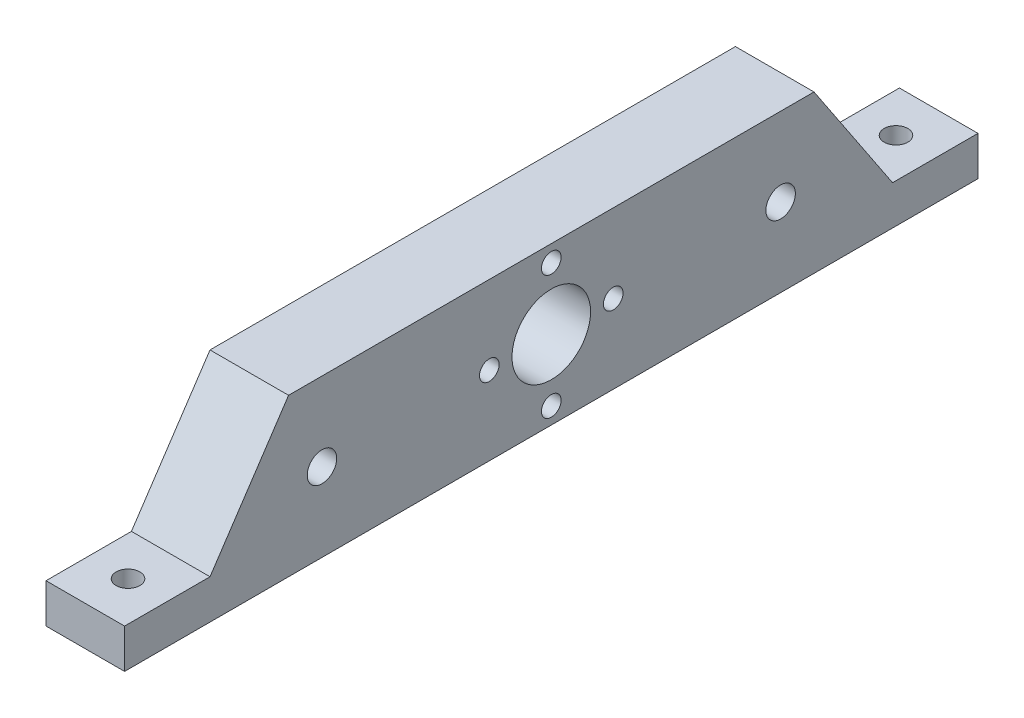
ISO-10303-21;
HEADER;
FILE_DESCRIPTION(('STEP AP214'),'2;1');
FILE_NAME('part.step','',(''),(''),'','','');
FILE_SCHEMA(('AUTOMOTIVE_DESIGN { 1 0 10303 214 1 1 1 1 }'));
ENDSEC;
DATA;
#1=APPLICATION_CONTEXT('core data for automotive mechanical design processes');
#2=APPLICATION_PROTOCOL_DEFINITION('international standard','automotive_design',2000,#1);
#3=PRODUCT_CONTEXT('',#1,'mechanical');
#4=PRODUCT('Part','Part','',(#3));
#5=PRODUCT_RELATED_PRODUCT_CATEGORY('part','',(#4));
#6=PRODUCT_DEFINITION_FORMATION('','',#4);
#7=PRODUCT_DEFINITION_CONTEXT('part definition',#1,'design');
#8=PRODUCT_DEFINITION('design','',#6,#7);
#9=PRODUCT_DEFINITION_SHAPE('','',#8);
#10=(LENGTH_UNIT() NAMED_UNIT(*) SI_UNIT(.MILLI.,.METRE.));
#11=(NAMED_UNIT(*) PLANE_ANGLE_UNIT() SI_UNIT($,.RADIAN.));
#12=(NAMED_UNIT(*) SI_UNIT($,.STERADIAN.) SOLID_ANGLE_UNIT());
#13=UNCERTAINTY_MEASURE_WITH_UNIT(LENGTH_MEASURE(1.E-05),#10,'distance_accuracy_value','');
#14=(GEOMETRIC_REPRESENTATION_CONTEXT(3) GLOBAL_UNCERTAINTY_ASSIGNED_CONTEXT((#13)) GLOBAL_UNIT_ASSIGNED_CONTEXT((#10,
#11,#12)) REPRESENTATION_CONTEXT('',''));
#15=CARTESIAN_POINT('',(0.,0.,0.));
#16=DIRECTION('',(0.,0.,1.));
#17=DIRECTION('',(1.,0.,0.));
#18=AXIS2_PLACEMENT_3D('',#15,#16,#17);
#19=CARTESIAN_POINT('',(20.,0.,0.));
#20=DIRECTION('',(0.,1.,0.));
#21=DIRECTION('',(0.,0.,1.));
#22=AXIS2_PLACEMENT_3D('',#19,#20,#21);
#23=PLANE('',#22);
#24=CARTESIAN_POINT('',(10.,0.,-92.2625236452228));
#25=DIRECTION('',(0.,1.,0.));
#26=DIRECTION('',(0.,0.,1.));
#27=AXIS2_PLACEMENT_3D('',#24,#25,#26);
#28=CIRCLE('',#27,3.02342349060065);
#29=CARTESIAN_POINT('',(10.,0.,-89.2391001546222));
#30=VERTEX_POINT('',#29);
#31=EDGE_CURVE('E190',#30,#30,#28,.T.);
#32=ORIENTED_EDGE('',*,*,#31,.T.);
#33=EDGE_LOOP('',(#32));
#34=FACE_BOUND('',#33,.T.);
#35=CARTESIAN_POINT('',(10.,0.,-287.737476354777));
#36=DIRECTION('',(0.,1.,0.));
#37=DIRECTION('',(0.,0.,-1.));
#38=AXIS2_PLACEMENT_3D('',#35,#36,#37);
#39=CIRCLE('',#38,3.02342349060064);
#40=CARTESIAN_POINT('',(10.,0.,-290.760899845378));
#41=VERTEX_POINT('',#40);
#42=EDGE_CURVE('E195',#41,#41,#39,.T.);
#43=ORIENTED_EDGE('',*,*,#42,.T.);
#44=EDGE_LOOP('',(#43));
#45=FACE_BOUND('',#44,.T.);
#46=DIRECTION('',(1.,0.,0.));
#47=VECTOR('',#46,1.);
#48=CARTESIAN_POINT('',(-80.,0.,-81.389022590821));
#49=LINE('',#48,#47);
#50=CARTESIAN_POINT('',(0.,0.,-81.389022590821));
#51=VERTEX_POINT('',#50);
#52=CARTESIAN_POINT('',(20.,0.,-81.389022590821));
#53=VERTEX_POINT('',#52);
#54=EDGE_CURVE('E118',#51,#53,#49,.T.);
#55=ORIENTED_EDGE('',*,*,#54,.F.);
#56=DIRECTION('',(0.,0.,-1.));
#57=VECTOR('',#56,1.);
#58=CARTESIAN_POINT('',(0.,0.,0.));
#59=LINE('',#58,#57);
#60=CARTESIAN_POINT('',(0.,0.,-298.610977409179));
#61=VERTEX_POINT('',#60);
#62=EDGE_CURVE('E174',#51,#61,#59,.T.);
#63=ORIENTED_EDGE('',*,*,#62,.T.);
#64=DIRECTION('',(1.,0.,0.));
#65=VECTOR('',#64,1.);
#66=CARTESIAN_POINT('',(-80.,0.,-298.610977409179));
#67=LINE('',#66,#65);
#68=CARTESIAN_POINT('',(20.,0.,-298.610977409179));
#69=VERTEX_POINT('',#68);
#70=EDGE_CURVE('E145',#61,#69,#67,.T.);
#71=ORIENTED_EDGE('',*,*,#70,.T.);
#72=DIRECTION('',(0.,0.,-1.));
#73=VECTOR('',#72,1.);
#74=CARTESIAN_POINT('',(20.,0.,0.));
#75=LINE('',#74,#73);
#76=EDGE_CURVE('E160',#53,#69,#75,.T.);
#77=ORIENTED_EDGE('',*,*,#76,.F.);
#78=EDGE_LOOP('',(#55,#63,#71,#77));
#79=FACE_BOUND('',#78,.T.);
#80=ADVANCED_FACE('F38',(#34,#45,#79),#23,.F.);
#81=CARTESIAN_POINT('',(20.,40.,0.));
#82=DIRECTION('',(0.,1.,0.));
#83=DIRECTION('',(0.,0.,1.));
#84=AXIS2_PLACEMENT_3D('',#81,#82,#83);
#85=PLANE('',#84);
#86=DIRECTION('',(1.,0.,0.));
#87=VECTOR('',#86,1.);
#88=CARTESIAN_POINT('',(-80.,40.,-123.129236315783));
#89=LINE('',#88,#87);
#90=CARTESIAN_POINT('',(0.,40.,-123.129236315783));
#91=VERTEX_POINT('',#90);
#92=CARTESIAN_POINT('',(20.,40.,-123.129236315783));
#93=VERTEX_POINT('',#92);
#94=EDGE_CURVE('E132',#91,#93,#89,.T.);
#95=ORIENTED_EDGE('',*,*,#94,.T.);
#96=DIRECTION('',(0.,0.,-1.));
#97=VECTOR('',#96,1.);
#98=CARTESIAN_POINT('',(20.,40.,0.));
#99=LINE('',#98,#97);
#100=CARTESIAN_POINT('',(20.,40.,-256.870763684217));
#101=VERTEX_POINT('',#100);
#102=EDGE_CURVE('E162',#93,#101,#99,.T.);
#103=ORIENTED_EDGE('',*,*,#102,.T.);
#104=DIRECTION('',(1.,0.,0.));
#105=VECTOR('',#104,1.);
#106=CARTESIAN_POINT('',(-80.,40.,-256.870763684217));
#107=LINE('',#106,#105);
#108=CARTESIAN_POINT('',(0.,40.,-256.870763684217));
#109=VERTEX_POINT('',#108);
#110=EDGE_CURVE('E122',#109,#101,#107,.T.);
#111=ORIENTED_EDGE('',*,*,#110,.F.);
#112=DIRECTION('',(0.,0.,-1.));
#113=VECTOR('',#112,1.);
#114=CARTESIAN_POINT('',(0.,40.,0.));
#115=LINE('',#114,#113);
#116=EDGE_CURVE('E154',#91,#109,#115,.T.);
#117=ORIENTED_EDGE('',*,*,#116,.F.);
#118=EDGE_LOOP('',(#95,#103,#111,#117));
#119=FACE_BOUND('',#118,.T.);
#120=ADVANCED_FACE('F238',(#119),#85,.T.);
#121=CARTESIAN_POINT('',(20.,0.,0.));
#122=DIRECTION('',(1.,0.,0.));
#123=DIRECTION('',(0.,0.,-1.));
#124=AXIS2_PLACEMENT_3D('',#121,#122,#123);
#125=PLANE('',#124);
#126=CARTESIAN_POINT('',(20.,35.7650866997217,-190.));
#127=DIRECTION('',(1.,0.,0.));
#128=DIRECTION('',(0.,0.,-1.));
#129=AXIS2_PLACEMENT_3D('',#126,#127,#128);
#130=CIRCLE('',#129,2.5);
#131=CARTESIAN_POINT('',(20.,35.7650866997217,-192.5));
#132=VERTEX_POINT('',#131);
#133=EDGE_CURVE('E220',#132,#132,#130,.T.);
#134=ORIENTED_EDGE('',*,*,#133,.F.);
#135=EDGE_LOOP('',(#134));
#136=FACE_BOUND('',#135,.T.);
#137=CARTESIAN_POINT('',(20.,4.23491330027833,-190.));
#138=DIRECTION('',(1.,0.,0.));
#139=DIRECTION('',(0.,0.,1.));
#140=AXIS2_PLACEMENT_3D('',#137,#138,#139);
#141=CIRCLE('',#140,2.5);
#142=CARTESIAN_POINT('',(20.,4.23491330027833,-187.5));
#143=VERTEX_POINT('',#142);
#144=EDGE_CURVE('E217',#143,#143,#141,.T.);
#145=ORIENTED_EDGE('',*,*,#144,.F.);
#146=EDGE_LOOP('',(#145));
#147=FACE_BOUND('',#146,.T.);
#148=CARTESIAN_POINT('',(20.,20.,-174.230000000001));
#149=DIRECTION('',(1.,0.,0.));
#150=DIRECTION('',(0.,0.,-1.));
#151=AXIS2_PLACEMENT_3D('',#148,#149,#150);
#152=CIRCLE('',#151,2.5);
#153=CARTESIAN_POINT('',(20.,20.,-176.730000000001));
#154=VERTEX_POINT('',#153);
#155=EDGE_CURVE('E211',#154,#154,#152,.T.);
#156=ORIENTED_EDGE('',*,*,#155,.F.);
#157=EDGE_LOOP('',(#156));
#158=FACE_BOUND('',#157,.T.);
#159=CARTESIAN_POINT('',(20.,20.,-205.770000000001));
#160=DIRECTION('',(1.,0.,0.));
#161=DIRECTION('',(0.,0.,1.));
#162=AXIS2_PLACEMENT_3D('',#159,#160,#161);
#163=CIRCLE('',#162,2.5);
#164=CARTESIAN_POINT('',(20.,20.,-203.270000000001));
#165=VERTEX_POINT('',#164);
#166=EDGE_CURVE('E205',#165,#165,#163,.T.);
#167=ORIENTED_EDGE('',*,*,#166,.F.);
#168=EDGE_LOOP('',(#167));
#169=FACE_BOUND('',#168,.T.);
#170=CARTESIAN_POINT('',(20.,20.,-248.37));
#171=DIRECTION('',(1.,0.,0.));
#172=DIRECTION('',(0.,0.,-1.));
#173=AXIS2_PLACEMENT_3D('',#170,#171,#172);
#174=CIRCLE('',#173,3.75000000000001);
#175=CARTESIAN_POINT('',(20.,20.,-252.12));
#176=VERTEX_POINT('',#175);
#177=EDGE_CURVE('E150',#176,#176,#174,.T.);
#178=ORIENTED_EDGE('',*,*,#177,.F.);
#179=EDGE_LOOP('',(#178));
#180=FACE_BOUND('',#179,.T.);
#181=CARTESIAN_POINT('',(20.,20.,-131.63));
#182=DIRECTION('',(1.,0.,0.));
#183=DIRECTION('',(0.,0.,-1.));
#184=AXIS2_PLACEMENT_3D('',#181,#182,#183);
#185=CIRCLE('',#184,3.75000000000001);
#186=CARTESIAN_POINT('',(20.,20.,-135.38));
#187=VERTEX_POINT('',#186);
#188=EDGE_CURVE('E153',#187,#187,#185,.T.);
#189=ORIENTED_EDGE('',*,*,#188,.F.);
#190=EDGE_LOOP('',(#189));
#191=FACE_BOUND('',#190,.T.);
#192=CARTESIAN_POINT('',(20.,20.,-190.));
#193=DIRECTION('',(1.,0.,0.));
#194=DIRECTION('',(0.,0.,-1.));
#195=AXIS2_PLACEMENT_3D('',#192,#193,#194);
#196=CIRCLE('',#195,10.);
#197=CARTESIAN_POINT('',(20.,20.,-200.));
#198=VERTEX_POINT('',#197);
#199=EDGE_CURVE('E157',#198,#198,#196,.T.);
#200=ORIENTED_EDGE('',*,*,#199,.F.);
#201=EDGE_LOOP('',(#200));
#202=FACE_BOUND('',#201,.T.);
#203=DIRECTION('',(0.,0.,1.));
#204=VECTOR('',#203,1.);
#205=CARTESIAN_POINT('',(20.,10.,0.));
#206=LINE('',#205,#204);
#207=CARTESIAN_POINT('',(20.,9.99999999999999,-103.136024699625));
#208=VERTEX_POINT('',#207);
#209=CARTESIAN_POINT('',(20.,10.,-81.389022590821));
#210=VERTEX_POINT('',#209);
#211=EDGE_CURVE('E106',#208,#210,#206,.T.);
#212=ORIENTED_EDGE('',*,*,#211,.T.);
#213=DIRECTION('',(0.,-1.,0.));
#214=VECTOR('',#213,1.);
#215=CARTESIAN_POINT('',(20.,0.,-81.389022590821));
#216=LINE('',#215,#214);
#217=EDGE_CURVE('E115',#210,#53,#216,.T.);
#218=ORIENTED_EDGE('',*,*,#217,.T.);
#219=ORIENTED_EDGE('',*,*,#76,.T.);
#220=DIRECTION('',(0.,-1.,0.));
#221=VECTOR('',#220,1.);
#222=CARTESIAN_POINT('',(20.,0.,-298.610977409179));
#223=LINE('',#222,#221);
#224=CARTESIAN_POINT('',(20.,10.,-298.610977409179));
#225=VERTEX_POINT('',#224);
#226=EDGE_CURVE('E141',#225,#69,#223,.T.);
#227=ORIENTED_EDGE('',*,*,#226,.F.);
#228=DIRECTION('',(0.,0.,-1.));
#229=VECTOR('',#228,1.);
#230=CARTESIAN_POINT('',(20.,9.99999999999998,0.));
#231=LINE('',#230,#229);
#232=CARTESIAN_POINT('',(20.,10.,-276.863975300375));
#233=VERTEX_POINT('',#232);
#234=EDGE_CURVE('E139',#233,#225,#231,.T.);
#235=ORIENTED_EDGE('',*,*,#234,.F.);
#236=DIRECTION('',(0.,0.832137189766942,0.554569830956189));
#237=VECTOR('',#236,1.);
#238=CARTESIAN_POINT('',(20.,130.842160586371,-196.329879008473));
#239=LINE('',#238,#237);
#240=EDGE_CURVE('E136',#233,#101,#239,.T.);
#241=ORIENTED_EDGE('',*,*,#240,.T.);
#242=ORIENTED_EDGE('',*,*,#102,.F.);
#243=DIRECTION('',(0.,0.832137189766942,-0.55456983095619));
#244=VECTOR('',#243,1.);
#245=CARTESIAN_POINT('',(20.,-44.5195480649654,-66.8019959769526));
#246=LINE('',#245,#244);
#247=EDGE_CURVE('E112',#208,#93,#246,.T.);
#248=ORIENTED_EDGE('',*,*,#247,.F.);
#249=EDGE_LOOP('',(#212,#218,#219,#227,#235,#241,#242,#248));
#250=FACE_BOUND('',#249,.T.);
#251=ADVANCED_FACE('F124',(#136,#147,#158,#169,#180,#191,#202,#250),#125,.T.);
#252=CARTESIAN_POINT('',(0.,0.,0.));
#253=DIRECTION('',(1.,0.,0.));
#254=DIRECTION('',(0.,0.,-1.));
#255=AXIS2_PLACEMENT_3D('',#252,#253,#254);
#256=PLANE('',#255);
#257=CARTESIAN_POINT('',(0.,35.7650866997217,-190.));
#258=DIRECTION('',(1.,0.,0.));
#259=DIRECTION('',(0.,0.,-1.));
#260=AXIS2_PLACEMENT_3D('',#257,#258,#259);
#261=CIRCLE('',#260,2.5);
#262=CARTESIAN_POINT('',(0.,35.7650866997217,-192.5));
#263=VERTEX_POINT('',#262);
#264=EDGE_CURVE('E200',#263,#263,#261,.T.);
#265=ORIENTED_EDGE('',*,*,#264,.T.);
#266=EDGE_LOOP('',(#265));
#267=FACE_BOUND('',#266,.T.);
#268=CARTESIAN_POINT('',(0.,4.23491330027833,-190.));
#269=DIRECTION('',(1.,0.,0.));
#270=DIRECTION('',(0.,0.,1.));
#271=AXIS2_PLACEMENT_3D('',#268,#269,#270);
#272=CIRCLE('',#271,2.5);
#273=CARTESIAN_POINT('',(0.,4.23491330027833,-187.5));
#274=VERTEX_POINT('',#273);
#275=EDGE_CURVE('E214',#274,#274,#272,.T.);
#276=ORIENTED_EDGE('',*,*,#275,.T.);
#277=EDGE_LOOP('',(#276));
#278=FACE_BOUND('',#277,.T.);
#279=CARTESIAN_POINT('',(0.,20.,-174.230000000001));
#280=DIRECTION('',(1.,0.,0.));
#281=DIRECTION('',(0.,0.,-1.));
#282=AXIS2_PLACEMENT_3D('',#279,#280,#281);
#283=CIRCLE('',#282,2.5);
#284=CARTESIAN_POINT('',(0.,20.,-176.730000000001));
#285=VERTEX_POINT('',#284);
#286=EDGE_CURVE('E208',#285,#285,#283,.T.);
#287=ORIENTED_EDGE('',*,*,#286,.T.);
#288=EDGE_LOOP('',(#287));
#289=FACE_BOUND('',#288,.T.);
#290=CARTESIAN_POINT('',(0.,20.,-205.770000000001));
#291=DIRECTION('',(1.,0.,0.));
#292=DIRECTION('',(0.,0.,1.));
#293=AXIS2_PLACEMENT_3D('',#290,#291,#292);
#294=CIRCLE('',#293,2.5);
#295=CARTESIAN_POINT('',(0.,20.,-203.270000000001));
#296=VERTEX_POINT('',#295);
#297=EDGE_CURVE('E202',#296,#296,#294,.T.);
#298=ORIENTED_EDGE('',*,*,#297,.T.);
#299=EDGE_LOOP('',(#298));
#300=FACE_BOUND('',#299,.T.);
#301=CARTESIAN_POINT('',(0.,20.,-248.37));
#302=DIRECTION('',(1.,0.,0.));
#303=DIRECTION('',(0.,0.,-1.));
#304=AXIS2_PLACEMENT_3D('',#301,#302,#303);
#305=CIRCLE('',#304,3.75000000000001);
#306=CARTESIAN_POINT('',(0.,20.,-252.12));
#307=VERTEX_POINT('',#306);
#308=EDGE_CURVE('E131',#307,#307,#305,.T.);
#309=ORIENTED_EDGE('',*,*,#308,.T.);
#310=EDGE_LOOP('',(#309));
#311=FACE_BOUND('',#310,.T.);
#312=CARTESIAN_POINT('',(0.,20.,-131.63));
#313=DIRECTION('',(1.,0.,0.));
#314=DIRECTION('',(0.,0.,-1.));
#315=AXIS2_PLACEMENT_3D('',#312,#313,#314);
#316=CIRCLE('',#315,3.75000000000001);
#317=CARTESIAN_POINT('',(0.,20.,-135.38));
#318=VERTEX_POINT('',#317);
#319=EDGE_CURVE('E168',#318,#318,#316,.T.);
#320=ORIENTED_EDGE('',*,*,#319,.T.);
#321=EDGE_LOOP('',(#320));
#322=FACE_BOUND('',#321,.T.);
#323=CARTESIAN_POINT('',(0.,20.,-190.));
#324=DIRECTION('',(1.,0.,0.));
#325=DIRECTION('',(0.,0.,-1.));
#326=AXIS2_PLACEMENT_3D('',#323,#324,#325);
#327=CIRCLE('',#326,10.);
#328=CARTESIAN_POINT('',(0.,20.,-200.));
#329=VERTEX_POINT('',#328);
#330=EDGE_CURVE('E171',#329,#329,#327,.T.);
#331=ORIENTED_EDGE('',*,*,#330,.T.);
#332=EDGE_LOOP('',(#331));
#333=FACE_BOUND('',#332,.T.);
#334=DIRECTION('',(0.,-1.,0.));
#335=VECTOR('',#334,1.);
#336=CARTESIAN_POINT('',(0.,0.,-81.389022590821));
#337=LINE('',#336,#335);
#338=CARTESIAN_POINT('',(0.,10.,-81.389022590821));
#339=VERTEX_POINT('',#338);
#340=EDGE_CURVE('E11',#339,#51,#337,.T.);
#341=ORIENTED_EDGE('',*,*,#340,.F.);
#342=DIRECTION('',(0.,0.,1.));
#343=VECTOR('',#342,1.);
#344=CARTESIAN_POINT('',(0.,10.,0.));
#345=LINE('',#344,#343);
#346=CARTESIAN_POINT('',(0.,10.,-103.136024699625));
#347=VERTEX_POINT('',#346);
#348=EDGE_CURVE('E109',#347,#339,#345,.T.);
#349=ORIENTED_EDGE('',*,*,#348,.F.);
#350=DIRECTION('',(0.,0.832137189766942,-0.55456983095619));
#351=VECTOR('',#350,1.);
#352=CARTESIAN_POINT('',(0.,-44.5195480649654,-66.8019959769526));
#353=LINE('',#352,#351);
#354=EDGE_CURVE('E47',#347,#91,#353,.T.);
#355=ORIENTED_EDGE('',*,*,#354,.T.);
#356=ORIENTED_EDGE('',*,*,#116,.T.);
#357=DIRECTION('',(0.,0.832137189766942,0.554569830956189));
#358=VECTOR('',#357,1.);
#359=CARTESIAN_POINT('',(0.,130.842160586371,-196.329879008473));
#360=LINE('',#359,#358);
#361=CARTESIAN_POINT('',(0.,10.,-276.863975300375));
#362=VERTEX_POINT('',#361);
#363=EDGE_CURVE('E184',#362,#109,#360,.T.);
#364=ORIENTED_EDGE('',*,*,#363,.F.);
#365=DIRECTION('',(0.,0.,-1.));
#366=VECTOR('',#365,1.);
#367=CARTESIAN_POINT('',(0.,9.99999999999998,0.));
#368=LINE('',#367,#366);
#369=CARTESIAN_POINT('',(0.,10.,-298.610977409179));
#370=VERTEX_POINT('',#369);
#371=EDGE_CURVE('E165',#362,#370,#368,.T.);
#372=ORIENTED_EDGE('',*,*,#371,.T.);
#373=DIRECTION('',(0.,-1.,0.));
#374=VECTOR('',#373,1.);
#375=CARTESIAN_POINT('',(0.,0.,-298.610977409179));
#376=LINE('',#375,#374);
#377=EDGE_CURVE('E181',#370,#61,#376,.T.);
#378=ORIENTED_EDGE('',*,*,#377,.T.);
#379=ORIENTED_EDGE('',*,*,#62,.F.);
#380=EDGE_LOOP('',(#341,#349,#355,#356,#364,#372,#378,#379));
#381=FACE_BOUND('',#380,.T.);
#382=ADVANCED_FACE('F226',(#267,#278,#289,#300,#311,#322,#333,#381),#256,.F.);
#383=CARTESIAN_POINT('',(20.,20.,-190.));
#384=DIRECTION('',(-1.,0.,0.));
#385=DIRECTION('',(0.,0.,1.));
#386=AXIS2_PLACEMENT_3D('',#383,#384,#385);
#387=CYLINDRICAL_SURFACE('',#386,10.);
#388=ORIENTED_EDGE('',*,*,#199,.T.);
#389=EDGE_LOOP('',(#388));
#390=FACE_BOUND('',#389,.T.);
#391=ORIENTED_EDGE('',*,*,#330,.F.);
#392=EDGE_LOOP('',(#391));
#393=FACE_BOUND('',#392,.T.);
#394=ADVANCED_FACE('F252',(#390,#393),#387,.F.);
#395=CARTESIAN_POINT('',(20.,20.,-131.63));
#396=DIRECTION('',(-1.,0.,0.));
#397=DIRECTION('',(0.,0.,1.));
#398=AXIS2_PLACEMENT_3D('',#395,#396,#397);
#399=CYLINDRICAL_SURFACE('',#398,3.75000000000001);
#400=ORIENTED_EDGE('',*,*,#188,.T.);
#401=EDGE_LOOP('',(#400));
#402=FACE_BOUND('',#401,.T.);
#403=ORIENTED_EDGE('',*,*,#319,.F.);
#404=EDGE_LOOP('',(#403));
#405=FACE_BOUND('',#404,.T.);
#406=ADVANCED_FACE('F255',(#402,#405),#399,.F.);
#407=CARTESIAN_POINT('',(20.,20.,-248.37));
#408=DIRECTION('',(-1.,0.,0.));
#409=DIRECTION('',(0.,0.,1.));
#410=AXIS2_PLACEMENT_3D('',#407,#408,#409);
#411=CYLINDRICAL_SURFACE('',#410,3.75000000000001);
#412=ORIENTED_EDGE('',*,*,#177,.T.);
#413=EDGE_LOOP('',(#412));
#414=FACE_BOUND('',#413,.T.);
#415=ORIENTED_EDGE('',*,*,#308,.F.);
#416=EDGE_LOOP('',(#415));
#417=FACE_BOUND('',#416,.T.);
#418=ADVANCED_FACE('F40',(#414,#417),#411,.F.);
#419=CARTESIAN_POINT('',(-80.,130.842160586371,-196.329879008473));
#420=DIRECTION('',(0.,0.554569830956189,-0.832137189766942));
#421=DIRECTION('',(0.,0.832137189766942,0.554569830956189));
#422=AXIS2_PLACEMENT_3D('',#419,#420,#421);
#423=PLANE('',#422);
#424=ORIENTED_EDGE('',*,*,#363,.T.);
#425=ORIENTED_EDGE('',*,*,#110,.T.);
#426=ORIENTED_EDGE('',*,*,#240,.F.);
#427=DIRECTION('',(1.,0.,0.));
#428=VECTOR('',#427,1.);
#429=CARTESIAN_POINT('',(-80.,10.,-276.863975300375));
#430=LINE('',#429,#428);
#431=EDGE_CURVE('E143',#362,#233,#430,.T.);
#432=ORIENTED_EDGE('',*,*,#431,.F.);
#433=EDGE_LOOP('',(#424,#425,#426,#432));
#434=FACE_BOUND('',#433,.T.);
#435=ADVANCED_FACE('F273',(#434),#423,.T.);
#436=CARTESIAN_POINT('',(-80.,0.,-298.610977409179));
#437=DIRECTION('',(0.,0.,1.));
#438=DIRECTION('',(1.,0.,0.));
#439=AXIS2_PLACEMENT_3D('',#436,#437,#438);
#440=PLANE('',#439);
#441=DIRECTION('',(1.,0.,0.));
#442=VECTOR('',#441,1.);
#443=CARTESIAN_POINT('',(-80.,10.,-298.610977409179));
#444=LINE('',#443,#442);
#445=EDGE_CURVE('E63',#370,#225,#444,.T.);
#446=ORIENTED_EDGE('',*,*,#445,.T.);
#447=ORIENTED_EDGE('',*,*,#226,.T.);
#448=ORIENTED_EDGE('',*,*,#70,.F.);
#449=ORIENTED_EDGE('',*,*,#377,.F.);
#450=EDGE_LOOP('',(#446,#447,#448,#449));
#451=FACE_BOUND('',#450,.T.);
#452=ADVANCED_FACE('F267',(#451),#440,.F.);
#453=CARTESIAN_POINT('',(-80.,9.99999999999998,0.));
#454=DIRECTION('',(0.,-1.,0.));
#455=DIRECTION('',(0.,0.,-1.));
#456=AXIS2_PLACEMENT_3D('',#453,#454,#455);
#457=PLANE('',#456);
#458=CARTESIAN_POINT('',(10.,10.,-287.737476354777));
#459=DIRECTION('',(0.,-1.,0.));
#460=DIRECTION('',(0.,0.,-1.));
#461=AXIS2_PLACEMENT_3D('',#458,#459,#460);
#462=CIRCLE('',#461,3.02342349060064);
#463=CARTESIAN_POINT('',(10.,10.,-290.760899845378));
#464=VERTEX_POINT('',#463);
#465=EDGE_CURVE('E42',#464,#464,#462,.T.);
#466=ORIENTED_EDGE('',*,*,#465,.T.);
#467=EDGE_LOOP('',(#466));
#468=FACE_BOUND('',#467,.T.);
#469=ORIENTED_EDGE('',*,*,#431,.T.);
#470=ORIENTED_EDGE('',*,*,#234,.T.);
#471=ORIENTED_EDGE('',*,*,#445,.F.);
#472=ORIENTED_EDGE('',*,*,#371,.F.);
#473=EDGE_LOOP('',(#469,#470,#471,#472));
#474=FACE_BOUND('',#473,.T.);
#475=ADVANCED_FACE('F268',(#468,#474),#457,.F.);
#476=CARTESIAN_POINT('',(-80.,0.,-81.389022590821));
#477=DIRECTION('',(0.,0.,1.));
#478=DIRECTION('',(1.,0.,0.));
#479=AXIS2_PLACEMENT_3D('',#476,#477,#478);
#480=PLANE('',#479);
#481=ORIENTED_EDGE('',*,*,#340,.T.);
#482=ORIENTED_EDGE('',*,*,#54,.T.);
#483=ORIENTED_EDGE('',*,*,#217,.F.);
#484=DIRECTION('',(1.,0.,0.));
#485=VECTOR('',#484,1.);
#486=CARTESIAN_POINT('',(-80.,10.,-81.389022590821));
#487=LINE('',#486,#485);
#488=EDGE_CURVE('E102',#339,#210,#487,.T.);
#489=ORIENTED_EDGE('',*,*,#488,.F.);
#490=EDGE_LOOP('',(#481,#482,#483,#489));
#491=FACE_BOUND('',#490,.T.);
#492=ADVANCED_FACE('F116',(#491),#480,.T.);
#493=CARTESIAN_POINT('',(-80.,-44.5195480649654,-66.8019959769526));
#494=DIRECTION('',(0.,-0.55456983095619,-0.832137189766942));
#495=DIRECTION('',(0.,0.832137189766942,-0.55456983095619));
#496=AXIS2_PLACEMENT_3D('',#493,#494,#495);
#497=PLANE('',#496);
#498=DIRECTION('',(1.,0.,0.));
#499=VECTOR('',#498,1.);
#500=CARTESIAN_POINT('',(-80.,9.99999999999999,-103.136024699625));
#501=LINE('',#500,#499);
#502=EDGE_CURVE('E55',#347,#208,#501,.T.);
#503=ORIENTED_EDGE('',*,*,#502,.T.);
#504=ORIENTED_EDGE('',*,*,#247,.T.);
#505=ORIENTED_EDGE('',*,*,#94,.F.);
#506=ORIENTED_EDGE('',*,*,#354,.F.);
#507=EDGE_LOOP('',(#503,#504,#505,#506));
#508=FACE_BOUND('',#507,.T.);
#509=ADVANCED_FACE('F278',(#508),#497,.F.);
#510=CARTESIAN_POINT('',(-80.,10.,0.));
#511=DIRECTION('',(0.,1.,0.));
#512=DIRECTION('',(0.,0.,1.));
#513=AXIS2_PLACEMENT_3D('',#510,#511,#512);
#514=PLANE('',#513);
#515=CARTESIAN_POINT('',(10.,10.,-92.2625236452228));
#516=DIRECTION('',(0.,1.,0.));
#517=DIRECTION('',(0.,0.,1.));
#518=AXIS2_PLACEMENT_3D('',#515,#516,#517);
#519=CIRCLE('',#518,3.02342349060065);
#520=CARTESIAN_POINT('',(10.,10.,-89.2391001546222));
#521=VERTEX_POINT('',#520);
#522=EDGE_CURVE('E188',#521,#521,#519,.T.);
#523=ORIENTED_EDGE('',*,*,#522,.F.);
#524=EDGE_LOOP('',(#523));
#525=FACE_BOUND('',#524,.T.);
#526=ORIENTED_EDGE('',*,*,#348,.T.);
#527=ORIENTED_EDGE('',*,*,#488,.T.);
#528=ORIENTED_EDGE('',*,*,#211,.F.);
#529=ORIENTED_EDGE('',*,*,#502,.F.);
#530=EDGE_LOOP('',(#526,#527,#528,#529));
#531=FACE_BOUND('',#530,.T.);
#532=ADVANCED_FACE('F104',(#525,#531),#514,.T.);
#533=CARTESIAN_POINT('',(10.,0.,-92.2625236452228));
#534=DIRECTION('',(0.,1.,0.));
#535=DIRECTION('',(0.,0.,1.));
#536=AXIS2_PLACEMENT_3D('',#533,#534,#535);
#537=CYLINDRICAL_SURFACE('',#536,3.02342349060065);
#538=ORIENTED_EDGE('',*,*,#522,.T.);
#539=EDGE_LOOP('',(#538));
#540=FACE_BOUND('',#539,.T.);
#541=ORIENTED_EDGE('',*,*,#31,.F.);
#542=EDGE_LOOP('',(#541));
#543=FACE_BOUND('',#542,.T.);
#544=ADVANCED_FACE('F285',(#540,#543),#537,.F.);
#545=CARTESIAN_POINT('',(10.,0.,-287.737476354777));
#546=DIRECTION('',(0.,1.,0.));
#547=DIRECTION('',(0.,0.,1.));
#548=AXIS2_PLACEMENT_3D('',#545,#546,#547);
#549=CYLINDRICAL_SURFACE('',#548,3.02342349060064);
#550=ORIENTED_EDGE('',*,*,#42,.F.);
#551=EDGE_LOOP('',(#550));
#552=FACE_BOUND('',#551,.T.);
#553=ORIENTED_EDGE('',*,*,#465,.F.);
#554=EDGE_LOOP('',(#553));
#555=FACE_BOUND('',#554,.T.);
#556=ADVANCED_FACE('F324',(#552,#555),#549,.F.);
#557=CARTESIAN_POINT('',(0.,20.,-205.770000000001));
#558=DIRECTION('',(1.,0.,0.));
#559=DIRECTION('',(0.,0.,-1.));
#560=AXIS2_PLACEMENT_3D('',#557,#558,#559);
#561=CYLINDRICAL_SURFACE('',#560,2.5);
#562=ORIENTED_EDGE('',*,*,#297,.F.);
#563=EDGE_LOOP('',(#562));
#564=FACE_BOUND('',#563,.T.);
#565=ORIENTED_EDGE('',*,*,#166,.T.);
#566=EDGE_LOOP('',(#565));
#567=FACE_BOUND('',#566,.T.);
#568=ADVANCED_FACE('F326',(#564,#567),#561,.F.);
#569=CARTESIAN_POINT('',(0.,20.,-174.230000000001));
#570=DIRECTION('',(1.,0.,0.));
#571=DIRECTION('',(0.,0.,-1.));
#572=AXIS2_PLACEMENT_3D('',#569,#570,#571);
#573=CYLINDRICAL_SURFACE('',#572,2.5);
#574=ORIENTED_EDGE('',*,*,#286,.F.);
#575=EDGE_LOOP('',(#574));
#576=FACE_BOUND('',#575,.T.);
#577=ORIENTED_EDGE('',*,*,#155,.T.);
#578=EDGE_LOOP('',(#577));
#579=FACE_BOUND('',#578,.T.);
#580=ADVANCED_FACE('F332',(#576,#579),#573,.F.);
#581=CARTESIAN_POINT('',(0.,4.23491330027833,-190.));
#582=DIRECTION('',(1.,0.,0.));
#583=DIRECTION('',(0.,0.,-1.));
#584=AXIS2_PLACEMENT_3D('',#581,#582,#583);
#585=CYLINDRICAL_SURFACE('',#584,2.5);
#586=ORIENTED_EDGE('',*,*,#275,.F.);
#587=EDGE_LOOP('',(#586));
#588=FACE_BOUND('',#587,.T.);
#589=ORIENTED_EDGE('',*,*,#144,.T.);
#590=EDGE_LOOP('',(#589));
#591=FACE_BOUND('',#590,.T.);
#592=ADVANCED_FACE('F232',(#588,#591),#585,.F.);
#593=CARTESIAN_POINT('',(0.,35.7650866997217,-190.));
#594=DIRECTION('',(1.,0.,0.));
#595=DIRECTION('',(0.,0.,-1.));
#596=AXIS2_PLACEMENT_3D('',#593,#594,#595);
#597=CYLINDRICAL_SURFACE('',#596,2.5);
#598=ORIENTED_EDGE('',*,*,#264,.F.);
#599=EDGE_LOOP('',(#598));
#600=FACE_BOUND('',#599,.T.);
#601=ORIENTED_EDGE('',*,*,#133,.T.);
#602=EDGE_LOOP('',(#601));
#603=FACE_BOUND('',#602,.T.);
#604=ADVANCED_FACE('F229',(#600,#603),#597,.F.);
#605=CLOSED_SHELL('',(#80,#120,#251,#382,#394,#406,#418,#435,#452,#475,#492,#509,#532,#544,#556,
#568,#580,#592,#604));
#606=MANIFOLD_SOLID_BREP('B2',#605);
#607=ADVANCED_BREP_SHAPE_REPRESENTATION('',(#18,#606),#14);
#608=SHAPE_DEFINITION_REPRESENTATION(#9,#607);
ENDSEC;
END-ISO-10303-21;
